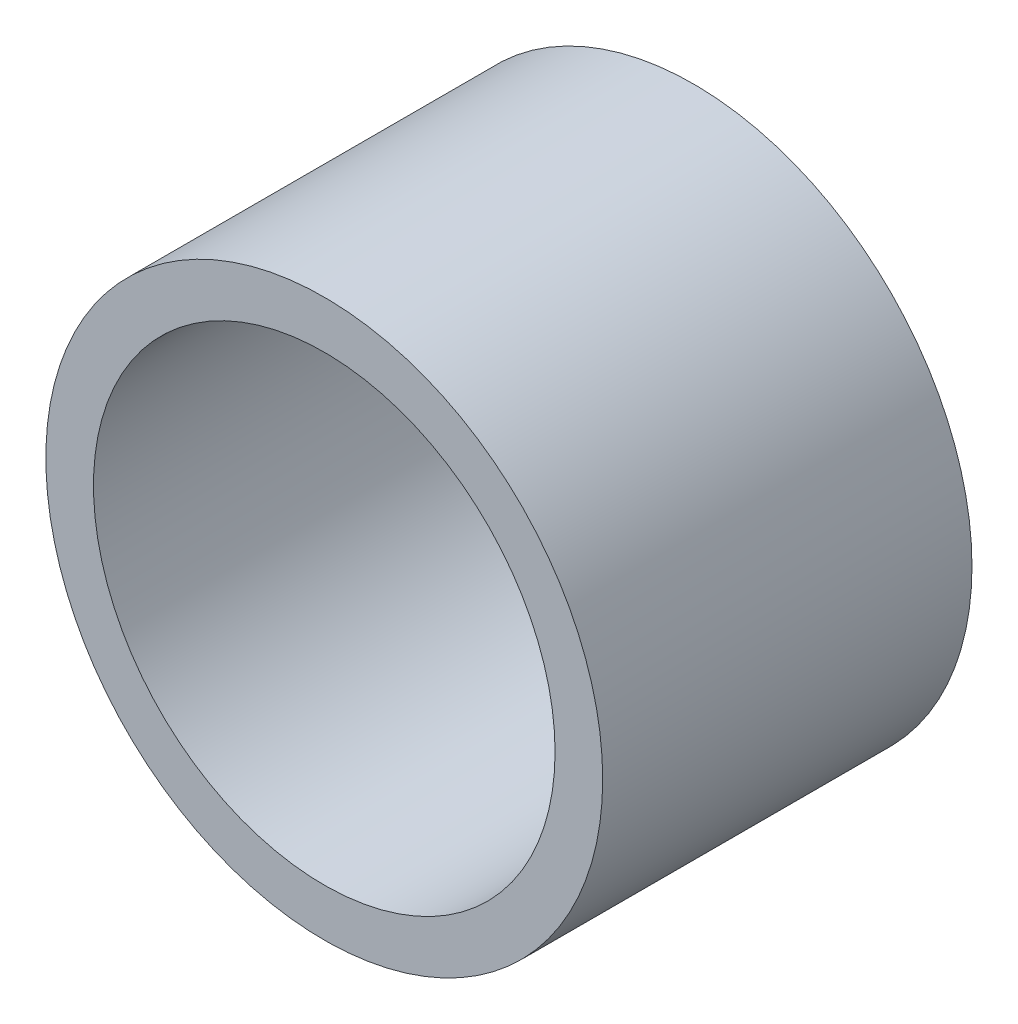
ISO-10303-21;
HEADER;
FILE_DESCRIPTION(('STEP AP214'),'2;1');
FILE_NAME('part.step','',(''),(''),'','','');
FILE_SCHEMA(('AUTOMOTIVE_DESIGN { 1 0 10303 214 1 1 1 1 }'));
ENDSEC;
DATA;
#1=APPLICATION_CONTEXT('core data for automotive mechanical design processes');
#2=APPLICATION_PROTOCOL_DEFINITION('international standard','automotive_design',2000,#1);
#3=PRODUCT_CONTEXT('',#1,'mechanical');
#4=PRODUCT('Part','Part','',(#3));
#5=PRODUCT_RELATED_PRODUCT_CATEGORY('part','',(#4));
#6=PRODUCT_DEFINITION_FORMATION('','',#4);
#7=PRODUCT_DEFINITION_CONTEXT('part definition',#1,'design');
#8=PRODUCT_DEFINITION('design','',#6,#7);
#9=PRODUCT_DEFINITION_SHAPE('','',#8);
#10=(LENGTH_UNIT() NAMED_UNIT(*) SI_UNIT(.MILLI.,.METRE.));
#11=(NAMED_UNIT(*) PLANE_ANGLE_UNIT() SI_UNIT($,.RADIAN.));
#12=(NAMED_UNIT(*) SI_UNIT($,.STERADIAN.) SOLID_ANGLE_UNIT());
#13=UNCERTAINTY_MEASURE_WITH_UNIT(LENGTH_MEASURE(1.E-05),#10,'distance_accuracy_value','');
#14=(GEOMETRIC_REPRESENTATION_CONTEXT(3) GLOBAL_UNCERTAINTY_ASSIGNED_CONTEXT((#13)) GLOBAL_UNIT_ASSIGNED_CONTEXT((#10,
#11,#12)) REPRESENTATION_CONTEXT('',''));
#15=CARTESIAN_POINT('',(0.,0.,0.));
#16=DIRECTION('',(0.,0.,1.));
#17=DIRECTION('',(1.,0.,0.));
#18=AXIS2_PLACEMENT_3D('',#15,#16,#17);
#19=CARTESIAN_POINT('',(0.,0.,3.175));
#20=DIRECTION('',(0.,0.,1.));
#21=DIRECTION('',(1.,0.,0.));
#22=AXIS2_PLACEMENT_3D('',#19,#20,#21);
#23=PLANE('',#22);
#24=CARTESIAN_POINT('',(0.,0.,3.175));
#25=DIRECTION('',(0.,0.,1.));
#26=DIRECTION('',(1.,0.,0.));
#27=AXIS2_PLACEMENT_3D('',#24,#25,#26);
#28=CIRCLE('',#27,4.7879);
#29=CARTESIAN_POINT('',(4.7879,0.,3.175));
#30=VERTEX_POINT('',#29);
#31=EDGE_CURVE('E10',#30,#30,#28,.T.);
#32=ORIENTED_EDGE('',*,*,#31,.T.);
#33=EDGE_LOOP('',(#32));
#34=FACE_BOUND('',#33,.T.);
#35=CARTESIAN_POINT('',(0.,0.,3.175));
#36=DIRECTION('',(0.,0.,1.));
#37=DIRECTION('',(1.,0.,0.));
#38=AXIS2_PLACEMENT_3D('',#35,#36,#37);
#39=CIRCLE('',#38,3.96875);
#40=CARTESIAN_POINT('',(3.96875,0.,3.175));
#41=VERTEX_POINT('',#40);
#42=EDGE_CURVE('E44',#41,#41,#39,.T.);
#43=ORIENTED_EDGE('',*,*,#42,.F.);
#44=EDGE_LOOP('',(#43));
#45=FACE_BOUND('',#44,.T.);
#46=ADVANCED_FACE('F33',(#34,#45),#23,.T.);
#47=CARTESIAN_POINT('',(0.,0.,-3.175));
#48=DIRECTION('',(0.,0.,1.));
#49=DIRECTION('',(1.,0.,0.));
#50=AXIS2_PLACEMENT_3D('',#47,#48,#49);
#51=PLANE('',#50);
#52=CARTESIAN_POINT('',(0.,0.,-3.175));
#53=DIRECTION('',(0.,0.,1.));
#54=DIRECTION('',(1.,0.,0.));
#55=AXIS2_PLACEMENT_3D('',#52,#53,#54);
#56=CIRCLE('',#55,4.7879);
#57=CARTESIAN_POINT('',(4.7879,0.,-3.175));
#58=VERTEX_POINT('',#57);
#59=EDGE_CURVE('E37',#58,#58,#56,.T.);
#60=ORIENTED_EDGE('',*,*,#59,.F.);
#61=EDGE_LOOP('',(#60));
#62=FACE_BOUND('',#61,.T.);
#63=CARTESIAN_POINT('',(0.,0.,-3.175));
#64=DIRECTION('',(0.,0.,1.));
#65=DIRECTION('',(1.,0.,0.));
#66=AXIS2_PLACEMENT_3D('',#63,#64,#65);
#67=CIRCLE('',#66,3.96875);
#68=CARTESIAN_POINT('',(3.96875,0.,-3.175));
#69=VERTEX_POINT('',#68);
#70=EDGE_CURVE('E46',#69,#69,#67,.T.);
#71=ORIENTED_EDGE('',*,*,#70,.T.);
#72=EDGE_LOOP('',(#71));
#73=FACE_BOUND('',#72,.T.);
#74=ADVANCED_FACE('F56',(#62,#73),#51,.F.);
#75=CARTESIAN_POINT('',(0.,0.,3.175));
#76=DIRECTION('',(0.,0.,-1.));
#77=DIRECTION('',(-1.,0.,0.));
#78=AXIS2_PLACEMENT_3D('',#75,#76,#77);
#79=CYLINDRICAL_SURFACE('',#78,4.7879);
#80=ORIENTED_EDGE('',*,*,#31,.F.);
#81=EDGE_LOOP('',(#80));
#82=FACE_BOUND('',#81,.T.);
#83=ORIENTED_EDGE('',*,*,#59,.T.);
#84=EDGE_LOOP('',(#83));
#85=FACE_BOUND('',#84,.T.);
#86=ADVANCED_FACE('F35',(#82,#85),#79,.T.);
#87=CARTESIAN_POINT('',(0.,0.,3.175));
#88=DIRECTION('',(0.,0.,-1.));
#89=DIRECTION('',(-1.,0.,0.));
#90=AXIS2_PLACEMENT_3D('',#87,#88,#89);
#91=CYLINDRICAL_SURFACE('',#90,3.96875);
#92=ORIENTED_EDGE('',*,*,#42,.T.);
#93=EDGE_LOOP('',(#92));
#94=FACE_BOUND('',#93,.T.);
#95=ORIENTED_EDGE('',*,*,#70,.F.);
#96=EDGE_LOOP('',(#95));
#97=FACE_BOUND('',#96,.T.);
#98=ADVANCED_FACE('F52',(#94,#97),#91,.F.);
#99=CLOSED_SHELL('',(#46,#74,#86,#98));
#100=MANIFOLD_SOLID_BREP('B2',#99);
#101=ADVANCED_BREP_SHAPE_REPRESENTATION('',(#18,#100),#14);
#102=SHAPE_DEFINITION_REPRESENTATION(#9,#101);
ENDSEC;
END-ISO-10303-21;
